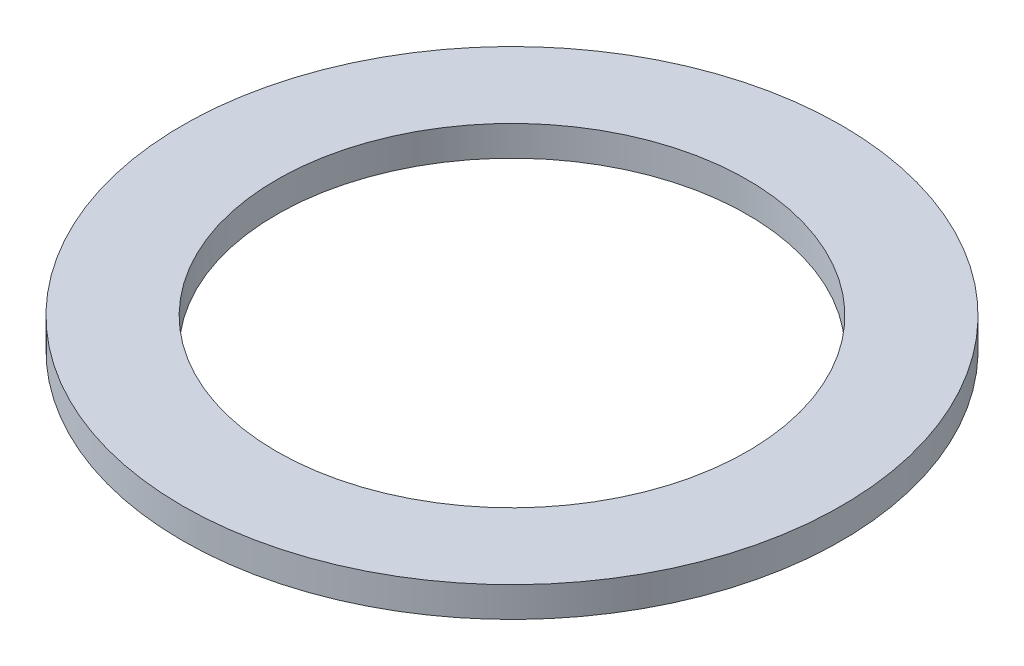
ISO-10303-21;
HEADER;
FILE_DESCRIPTION(('STEP AP214'),'2;1');
FILE_NAME('part.step','',(''),(''),'','','');
FILE_SCHEMA(('AUTOMOTIVE_DESIGN { 1 0 10303 214 1 1 1 1 }'));
ENDSEC;
DATA;
#1=APPLICATION_CONTEXT('core data for automotive mechanical design processes');
#2=APPLICATION_PROTOCOL_DEFINITION('international standard','automotive_design',2000,#1);
#3=PRODUCT_CONTEXT('',#1,'mechanical');
#4=PRODUCT('Part','Part','',(#3));
#5=PRODUCT_RELATED_PRODUCT_CATEGORY('part','',(#4));
#6=PRODUCT_DEFINITION_FORMATION('','',#4);
#7=PRODUCT_DEFINITION_CONTEXT('part definition',#1,'design');
#8=PRODUCT_DEFINITION('design','',#6,#7);
#9=PRODUCT_DEFINITION_SHAPE('','',#8);
#10=(LENGTH_UNIT() NAMED_UNIT(*) SI_UNIT(.MILLI.,.METRE.));
#11=(NAMED_UNIT(*) PLANE_ANGLE_UNIT() SI_UNIT($,.RADIAN.));
#12=(NAMED_UNIT(*) SI_UNIT($,.STERADIAN.) SOLID_ANGLE_UNIT());
#13=UNCERTAINTY_MEASURE_WITH_UNIT(LENGTH_MEASURE(1.E-05),#10,'distance_accuracy_value','');
#14=(GEOMETRIC_REPRESENTATION_CONTEXT(3) GLOBAL_UNCERTAINTY_ASSIGNED_CONTEXT((#13)) GLOBAL_UNIT_ASSIGNED_CONTEXT((#10,
#11,#12)) REPRESENTATION_CONTEXT('',''));
#15=CARTESIAN_POINT('',(0.,0.,0.));
#16=DIRECTION('',(0.,0.,1.));
#17=DIRECTION('',(1.,0.,0.));
#18=AXIS2_PLACEMENT_3D('',#15,#16,#17);
#19=CARTESIAN_POINT('',(0.,0.508,0.));
#20=DIRECTION('',(0.,-1.,0.));
#21=DIRECTION('',(0.,0.,-1.));
#22=AXIS2_PLACEMENT_3D('',#19,#20,#21);
#23=CYLINDRICAL_SURFACE('',#22,5.55625);
#24=CARTESIAN_POINT('',(0.,0.508,0.));
#25=DIRECTION('',(0.,1.,0.));
#26=DIRECTION('',(0.,0.,1.));
#27=AXIS2_PLACEMENT_3D('',#24,#25,#26);
#28=CIRCLE('',#27,5.55625);
#29=CARTESIAN_POINT('',(0.,0.508,5.55625));
#30=VERTEX_POINT('',#29);
#31=EDGE_CURVE('E10',#30,#30,#28,.T.);
#32=ORIENTED_EDGE('',*,*,#31,.F.);
#33=EDGE_LOOP('',(#32));
#34=FACE_BOUND('',#33,.T.);
#35=CARTESIAN_POINT('',(0.,0.,0.));
#36=DIRECTION('',(0.,1.,0.));
#37=DIRECTION('',(0.,0.,1.));
#38=AXIS2_PLACEMENT_3D('',#35,#36,#37);
#39=CIRCLE('',#38,5.55625);
#40=CARTESIAN_POINT('',(0.,0.,5.55625));
#41=VERTEX_POINT('',#40);
#42=EDGE_CURVE('E35',#41,#41,#39,.T.);
#43=ORIENTED_EDGE('',*,*,#42,.T.);
#44=EDGE_LOOP('',(#43));
#45=FACE_BOUND('',#44,.T.);
#46=ADVANCED_FACE('F32',(#34,#45),#23,.T.);
#47=CARTESIAN_POINT('',(0.,0.508,0.));
#48=DIRECTION('',(0.,1.,0.));
#49=DIRECTION('',(0.,0.,1.));
#50=AXIS2_PLACEMENT_3D('',#47,#48,#49);
#51=PLANE('',#50);
#52=CARTESIAN_POINT('',(0.,0.508,0.));
#53=DIRECTION('',(0.,1.,0.));
#54=DIRECTION('',(0.,0.,1.));
#55=AXIS2_PLACEMENT_3D('',#52,#53,#54);
#56=CIRCLE('',#55,3.96875);
#57=CARTESIAN_POINT('',(0.,0.508,3.96875));
#58=VERTEX_POINT('',#57);
#59=EDGE_CURVE('E44',#58,#58,#56,.T.);
#60=ORIENTED_EDGE('',*,*,#59,.F.);
#61=EDGE_LOOP('',(#60));
#62=FACE_BOUND('',#61,.T.);
#63=ORIENTED_EDGE('',*,*,#31,.T.);
#64=EDGE_LOOP('',(#63));
#65=FACE_BOUND('',#64,.T.);
#66=ADVANCED_FACE('F59',(#62,#65),#51,.T.);
#67=CARTESIAN_POINT('',(0.,0.,0.));
#68=DIRECTION('',(0.,1.,0.));
#69=DIRECTION('',(0.,0.,1.));
#70=AXIS2_PLACEMENT_3D('',#67,#68,#69);
#71=PLANE('',#70);
#72=CARTESIAN_POINT('',(0.,0.,0.));
#73=DIRECTION('',(0.,1.,0.));
#74=DIRECTION('',(0.,0.,1.));
#75=AXIS2_PLACEMENT_3D('',#72,#73,#74);
#76=CIRCLE('',#75,3.96875);
#77=CARTESIAN_POINT('',(0.,0.,3.96875));
#78=VERTEX_POINT('',#77);
#79=EDGE_CURVE('E42',#78,#78,#76,.T.);
#80=ORIENTED_EDGE('',*,*,#79,.T.);
#81=EDGE_LOOP('',(#80));
#82=FACE_BOUND('',#81,.T.);
#83=ORIENTED_EDGE('',*,*,#42,.F.);
#84=EDGE_LOOP('',(#83));
#85=FACE_BOUND('',#84,.T.);
#86=ADVANCED_FACE('F50',(#82,#85),#71,.F.);
#87=CARTESIAN_POINT('',(0.,0.,0.));
#88=DIRECTION('',(0.,1.,0.));
#89=DIRECTION('',(0.,0.,1.));
#90=AXIS2_PLACEMENT_3D('',#87,#88,#89);
#91=CYLINDRICAL_SURFACE('',#90,3.96875);
#92=ORIENTED_EDGE('',*,*,#79,.F.);
#93=EDGE_LOOP('',(#92));
#94=FACE_BOUND('',#93,.T.);
#95=ORIENTED_EDGE('',*,*,#59,.T.);
#96=EDGE_LOOP('',(#95));
#97=FACE_BOUND('',#96,.T.);
#98=ADVANCED_FACE('F53',(#94,#97),#91,.F.);
#99=CLOSED_SHELL('',(#46,#66,#86,#98));
#100=MANIFOLD_SOLID_BREP('B2',#99);
#101=ADVANCED_BREP_SHAPE_REPRESENTATION('',(#18,#100),#14);
#102=SHAPE_DEFINITION_REPRESENTATION(#9,#101);
ENDSEC;
END-ISO-10303-21;
